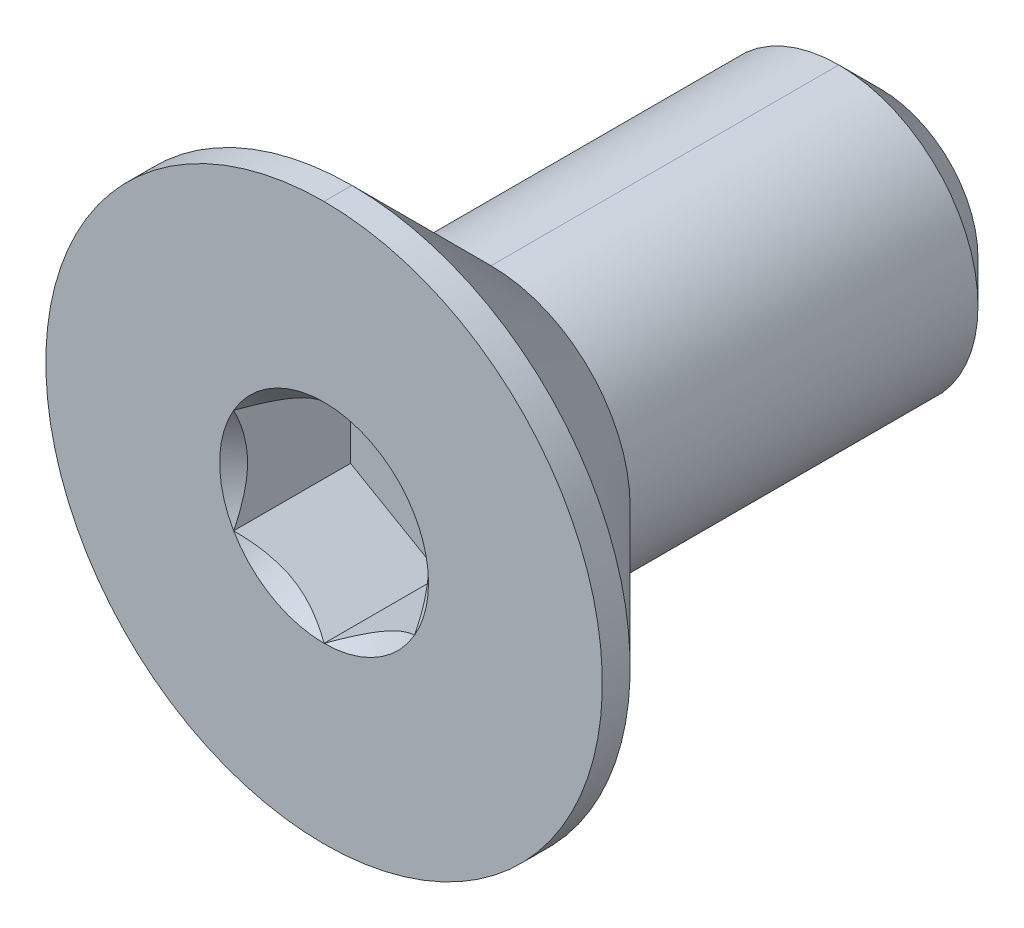
ISO-10303-21;
HEADER;
FILE_DESCRIPTION(('STEP AP214'),'2;1');
FILE_NAME('part.step','',(''),(''),'','','');
FILE_SCHEMA(('AUTOMOTIVE_DESIGN { 1 0 10303 214 1 1 1 1 }'));
ENDSEC;
DATA;
#1=APPLICATION_CONTEXT('core data for automotive mechanical design processes');
#2=APPLICATION_PROTOCOL_DEFINITION('international standard','automotive_design',2000,#1);
#3=PRODUCT_CONTEXT('',#1,'mechanical');
#4=PRODUCT('Part','Part','',(#3));
#5=PRODUCT_RELATED_PRODUCT_CATEGORY('part','',(#4));
#6=PRODUCT_DEFINITION_FORMATION('','',#4);
#7=PRODUCT_DEFINITION_CONTEXT('part definition',#1,'design');
#8=PRODUCT_DEFINITION('design','',#6,#7);
#9=PRODUCT_DEFINITION_SHAPE('','',#8);
#10=(LENGTH_UNIT() NAMED_UNIT(*) SI_UNIT(.MILLI.,.METRE.));
#11=(NAMED_UNIT(*) PLANE_ANGLE_UNIT() SI_UNIT($,.RADIAN.));
#12=(NAMED_UNIT(*) SI_UNIT($,.STERADIAN.) SOLID_ANGLE_UNIT());
#13=UNCERTAINTY_MEASURE_WITH_UNIT(LENGTH_MEASURE(1.E-05),#10,'distance_accuracy_value','');
#14=(GEOMETRIC_REPRESENTATION_CONTEXT(3) GLOBAL_UNCERTAINTY_ASSIGNED_CONTEXT((#13)) GLOBAL_UNIT_ASSIGNED_CONTEXT((#10,
#11,#12)) REPRESENTATION_CONTEXT('',''));
#15=CARTESIAN_POINT('',(0.,0.,0.));
#16=DIRECTION('',(0.,0.,1.));
#17=DIRECTION('',(1.,0.,0.));
#18=AXIS2_PLACEMENT_3D('',#15,#16,#17);
#19=CARTESIAN_POINT('',(0.,0.,0.));
#20=DIRECTION('',(0.,0.,1.));
#21=DIRECTION('',(1.,0.,0.));
#22=AXIS2_PLACEMENT_3D('',#19,#20,#21);
#23=CONICAL_SURFACE('',#22,0.750555349946514,0.78539816339745);
#24=CARTESIAN_POINT('',(0.65,0.,-0.100555349946514));
#25=CARTESIAN_POINT('',(0.65,0.17416697508023,-0.100555349946514));
#26=CARTESIAN_POINT('',(0.65,0.375277674973259,0.));
#27=B_SPLINE_CURVE_WITH_KNOTS('',2,(#24,#25,#26),.UNSPECIFIED.,.F.,.F.,(3,3),(0.,1.),.UNSPECIFIED.);
#28=CARTESIAN_POINT('',(0.65,0.,-0.100555349946514));
#29=VERTEX_POINT('',#28);
#30=CARTESIAN_POINT('',(0.65,0.375277674973259,0.));
#31=VERTEX_POINT('',#30);
#32=EDGE_CURVE('E43',#29,#31,#27,.T.);
#33=ORIENTED_EDGE('',*,*,#32,.F.);
#34=DIRECTION('',(0.707106781186549,0.,0.707106781186546));
#35=VECTOR('',#34,1.);
#36=CARTESIAN_POINT('',(0.750555349946514,0.,0.));
#37=LINE('',#36,#35);
#38=CARTESIAN_POINT('',(0.750555349946514,0.,0.));
#39=VERTEX_POINT('',#38);
#40=EDGE_CURVE('E11',#29,#39,#37,.T.);
#41=ORIENTED_EDGE('',*,*,#40,.T.);
#42=CARTESIAN_POINT('',(0.,0.,0.));
#43=DIRECTION('',(0.,0.,1.));
#44=DIRECTION('',(1.,0.,0.));
#45=AXIS2_PLACEMENT_3D('',#42,#43,#44);
#46=CIRCLE('',#45,0.750555349946514);
#47=EDGE_CURVE('E29',#39,#31,#46,.T.);
#48=ORIENTED_EDGE('',*,*,#47,.T.);
#49=EDGE_LOOP('',(#33,#41,#48));
#50=FACE_BOUND('',#49,.T.);
#51=ADVANCED_FACE('F16',(#50),#23,.F.);
#52=CARTESIAN_POINT('',(0.,0.,-1.2));
#53=DIRECTION('',(0.,0.,1.));
#54=DIRECTION('',(0.,-1.,0.));
#55=AXIS2_PLACEMENT_3D('',#52,#53,#54);
#56=CONICAL_SURFACE('',#55,1.,0.785398163397445);
#57=CARTESIAN_POINT('',(0.,0.,-1.2));
#58=DIRECTION('',(0.,0.,1.));
#59=DIRECTION('',(0.,-1.,0.));
#60=AXIS2_PLACEMENT_3D('',#57,#58,#59);
#61=CIRCLE('',#60,1.);
#62=CARTESIAN_POINT('',(0.,-1.00000000000001,-1.2));
#63=VERTEX_POINT('',#62);
#64=CARTESIAN_POINT('',(0.,1.,-1.2));
#65=VERTEX_POINT('',#64);
#66=EDGE_CURVE('E252',#63,#65,#61,.T.);
#67=ORIENTED_EDGE('',*,*,#66,.T.);
#68=DIRECTION('',(0.,0.707106781186549,0.707106781186546));
#69=VECTOR('',#68,1.);
#70=CARTESIAN_POINT('',(0.,1.,-1.2));
#71=LINE('',#70,#69);
#72=CARTESIAN_POINT('',(0.,2.,-0.200000000000005));
#73=VERTEX_POINT('',#72);
#74=EDGE_CURVE('E461',#65,#73,#71,.T.);
#75=ORIENTED_EDGE('',*,*,#74,.T.);
#76=CARTESIAN_POINT('',(0.,0.,-0.199999999999994));
#77=DIRECTION('',(0.,0.,1.));
#78=DIRECTION('',(0.,-1.,0.));
#79=AXIS2_PLACEMENT_3D('',#76,#77,#78);
#80=CIRCLE('',#79,2.);
#81=CARTESIAN_POINT('',(0.,-2.,-0.199999999999984));
#82=VERTEX_POINT('',#81);
#83=EDGE_CURVE('E457',#82,#73,#80,.T.);
#84=ORIENTED_EDGE('',*,*,#83,.F.);
#85=DIRECTION('',(0.,-0.707106781186542,0.707106781186553));
#86=VECTOR('',#85,1.);
#87=CARTESIAN_POINT('',(0.,-1.00000000000001,-1.2));
#88=LINE('',#87,#86);
#89=EDGE_CURVE('E474',#63,#82,#88,.T.);
#90=ORIENTED_EDGE('',*,*,#89,.F.);
#91=EDGE_LOOP('',(#67,#75,#84,#90));
#92=FACE_BOUND('',#91,.T.);
#93=ADVANCED_FACE('F232',(#92),#56,.T.);
#94=CARTESIAN_POINT('',(0.,0.,0.));
#95=DIRECTION('',(0.,0.,1.));
#96=DIRECTION('',(0.,-1.,0.));
#97=AXIS2_PLACEMENT_3D('',#94,#95,#96);
#98=CYLINDRICAL_SURFACE('',#97,2.);
#99=ORIENTED_EDGE('',*,*,#83,.T.);
#100=DIRECTION('',(0.,0.,1.));
#101=VECTOR('',#100,1.);
#102=CARTESIAN_POINT('',(0.,2.,0.));
#103=LINE('',#102,#101);
#104=CARTESIAN_POINT('',(0.,2.,0.));
#105=VERTEX_POINT('',#104);
#106=EDGE_CURVE('E462',#73,#105,#103,.T.);
#107=ORIENTED_EDGE('',*,*,#106,.T.);
#108=CARTESIAN_POINT('',(0.,0.,0.));
#109=DIRECTION('',(0.,0.,1.));
#110=DIRECTION('',(0.,-1.,0.));
#111=AXIS2_PLACEMENT_3D('',#108,#109,#110);
#112=CIRCLE('',#111,2.);
#113=CARTESIAN_POINT('',(0.,-2.,0.));
#114=VERTEX_POINT('',#113);
#115=EDGE_CURVE('E424',#114,#105,#112,.T.);
#116=ORIENTED_EDGE('',*,*,#115,.F.);
#117=DIRECTION('',(0.,0.,1.));
#118=VECTOR('',#117,1.);
#119=CARTESIAN_POINT('',(0.,-2.,0.));
#120=LINE('',#119,#118);
#121=EDGE_CURVE('E448',#82,#114,#120,.T.);
#122=ORIENTED_EDGE('',*,*,#121,.F.);
#123=EDGE_LOOP('',(#99,#107,#116,#122));
#124=FACE_BOUND('',#123,.T.);
#125=ADVANCED_FACE('F179',(#124),#98,.T.);
#126=CARTESIAN_POINT('',(0.,0.,-4.));
#127=DIRECTION('',(0.,0.,1.));
#128=DIRECTION('',(0.,-1.,0.));
#129=AXIS2_PLACEMENT_3D('',#126,#127,#128);
#130=CONICAL_SURFACE('',#129,0.7,0.785398163397446);
#131=CARTESIAN_POINT('',(0.,0.,-4.));
#132=DIRECTION('',(0.,0.,-1.));
#133=DIRECTION('',(0.,1.,0.));
#134=AXIS2_PLACEMENT_3D('',#131,#132,#133);
#135=CIRCLE('',#134,0.7);
#136=CARTESIAN_POINT('',(0.,0.7,-4.));
#137=VERTEX_POINT('',#136);
#138=CARTESIAN_POINT('',(0.,-0.7,-4.));
#139=VERTEX_POINT('',#138);
#140=EDGE_CURVE('E431',#137,#139,#135,.T.);
#141=ORIENTED_EDGE('',*,*,#140,.F.);
#142=DIRECTION('',(0.,0.707106781186546,0.707106781186549));
#143=VECTOR('',#142,1.);
#144=CARTESIAN_POINT('',(0.,0.7,-4.));
#145=LINE('',#144,#143);
#146=CARTESIAN_POINT('',(0.,1.,-3.7));
#147=VERTEX_POINT('',#146);
#148=EDGE_CURVE('E442',#137,#147,#145,.T.);
#149=ORIENTED_EDGE('',*,*,#148,.T.);
#150=CARTESIAN_POINT('',(0.,0.,-3.7));
#151=DIRECTION('',(0.,0.,1.));
#152=DIRECTION('',(0.,1.,0.));
#153=AXIS2_PLACEMENT_3D('',#150,#151,#152);
#154=CIRCLE('',#153,1.);
#155=CARTESIAN_POINT('',(0.,-1.,-3.7));
#156=VERTEX_POINT('',#155);
#157=EDGE_CURVE('E429',#156,#147,#154,.T.);
#158=ORIENTED_EDGE('',*,*,#157,.F.);
#159=DIRECTION('',(0.,-0.707106781186546,0.707106781186549));
#160=VECTOR('',#159,1.);
#161=CARTESIAN_POINT('',(0.,-0.7,-4.));
#162=LINE('',#161,#160);
#163=EDGE_CURVE('E435',#139,#156,#162,.T.);
#164=ORIENTED_EDGE('',*,*,#163,.F.);
#165=EDGE_LOOP('',(#141,#149,#158,#164));
#166=FACE_BOUND('',#165,.T.);
#167=ADVANCED_FACE('F176',(#166),#130,.T.);
#168=CARTESIAN_POINT('',(0.,0.,-4.));
#169=DIRECTION('',(0.,0.,-1.));
#170=DIRECTION('',(0.,1.,0.));
#171=AXIS2_PLACEMENT_3D('',#168,#169,#170);
#172=CYLINDRICAL_SURFACE('',#171,1.);
#173=ORIENTED_EDGE('',*,*,#66,.F.);
#174=DIRECTION('',(0.,0.,-1.));
#175=VECTOR('',#174,1.);
#176=CARTESIAN_POINT('',(0.,-1.,-4.));
#177=LINE('',#176,#175);
#178=EDGE_CURVE('E439',#63,#156,#177,.T.);
#179=ORIENTED_EDGE('',*,*,#178,.T.);
#180=ORIENTED_EDGE('',*,*,#157,.T.);
#181=DIRECTION('',(0.,0.,-1.));
#182=VECTOR('',#181,1.);
#183=CARTESIAN_POINT('',(0.,1.,-4.));
#184=LINE('',#183,#182);
#185=EDGE_CURVE('E425',#65,#147,#184,.T.);
#186=ORIENTED_EDGE('',*,*,#185,.F.);
#187=EDGE_LOOP('',(#173,#179,#180,#186));
#188=FACE_BOUND('',#187,.T.);
#189=ADVANCED_FACE('F18',(#188),#172,.T.);
#190=CARTESIAN_POINT('',(0.,0.,-4.));
#191=DIRECTION('',(0.,0.,-1.));
#192=DIRECTION('',(0.,1.,0.));
#193=AXIS2_PLACEMENT_3D('',#190,#191,#192);
#194=CYLINDRICAL_SURFACE('',#193,1.);
#195=ORIENTED_EDGE('',*,*,#178,.F.);
#196=CARTESIAN_POINT('',(0.,0.,-1.2));
#197=DIRECTION('',(0.,0.,1.));
#198=DIRECTION('',(0.,-1.,0.));
#199=AXIS2_PLACEMENT_3D('',#196,#197,#198);
#200=CIRCLE('',#199,1.);
#201=EDGE_CURVE('E456',#65,#63,#200,.T.);
#202=ORIENTED_EDGE('',*,*,#201,.F.);
#203=ORIENTED_EDGE('',*,*,#185,.T.);
#204=CARTESIAN_POINT('',(0.,0.,-3.7));
#205=DIRECTION('',(0.,0.,1.));
#206=DIRECTION('',(0.,1.,0.));
#207=AXIS2_PLACEMENT_3D('',#204,#205,#206);
#208=CIRCLE('',#207,1.);
#209=EDGE_CURVE('E430',#147,#156,#208,.T.);
#210=ORIENTED_EDGE('',*,*,#209,.T.);
#211=EDGE_LOOP('',(#195,#202,#203,#210));
#212=FACE_BOUND('',#211,.T.);
#213=ADVANCED_FACE('F233',(#212),#194,.T.);
#214=CARTESIAN_POINT('',(0.,-1.,-4.));
#215=DIRECTION('',(0.,0.,-1.));
#216=DIRECTION('',(0.,-1.,0.));
#217=AXIS2_PLACEMENT_3D('',#214,#215,#216);
#218=PLANE('',#217);
#219=CARTESIAN_POINT('',(0.,0.,-4.));
#220=DIRECTION('',(0.,0.,-1.));
#221=DIRECTION('',(0.,1.,0.));
#222=AXIS2_PLACEMENT_3D('',#219,#220,#221);
#223=CIRCLE('',#222,0.7);
#224=EDGE_CURVE('E434',#139,#137,#223,.T.);
#225=ORIENTED_EDGE('',*,*,#224,.T.);
#226=ORIENTED_EDGE('',*,*,#140,.T.);
#227=EDGE_LOOP('',(#225,#226));
#228=FACE_BOUND('',#227,.T.);
#229=ADVANCED_FACE('F186',(#228),#218,.T.);
#230=CARTESIAN_POINT('',(0.,0.,-4.));
#231=DIRECTION('',(0.,0.,1.));
#232=DIRECTION('',(0.,-1.,0.));
#233=AXIS2_PLACEMENT_3D('',#230,#231,#232);
#234=CONICAL_SURFACE('',#233,0.7,0.785398163397446);
#235=ORIENTED_EDGE('',*,*,#148,.F.);
#236=ORIENTED_EDGE('',*,*,#224,.F.);
#237=ORIENTED_EDGE('',*,*,#163,.T.);
#238=ORIENTED_EDGE('',*,*,#209,.F.);
#239=EDGE_LOOP('',(#235,#236,#237,#238));
#240=FACE_BOUND('',#239,.T.);
#241=ADVANCED_FACE('F362',(#240),#234,.T.);
#242=CARTESIAN_POINT('',(0.,0.,0.));
#243=DIRECTION('',(0.,0.,1.));
#244=DIRECTION('',(0.,-1.,0.));
#245=AXIS2_PLACEMENT_3D('',#242,#243,#244);
#246=CYLINDRICAL_SURFACE('',#245,2.);
#247=ORIENTED_EDGE('',*,*,#106,.F.);
#248=CARTESIAN_POINT('',(0.,0.,-0.199999999999994));
#249=DIRECTION('',(0.,0.,1.));
#250=DIRECTION('',(0.,-1.,0.));
#251=AXIS2_PLACEMENT_3D('',#248,#249,#250);
#252=CIRCLE('',#251,2.);
#253=EDGE_CURVE('E444',#73,#82,#252,.T.);
#254=ORIENTED_EDGE('',*,*,#253,.T.);
#255=ORIENTED_EDGE('',*,*,#121,.T.);
#256=CARTESIAN_POINT('',(0.,0.,0.));
#257=DIRECTION('',(0.,0.,1.));
#258=DIRECTION('',(0.,-1.,0.));
#259=AXIS2_PLACEMENT_3D('',#256,#257,#258);
#260=CIRCLE('',#259,2.);
#261=EDGE_CURVE('E390',#105,#114,#260,.T.);
#262=ORIENTED_EDGE('',*,*,#261,.F.);
#263=EDGE_LOOP('',(#247,#254,#255,#262));
#264=FACE_BOUND('',#263,.T.);
#265=ADVANCED_FACE('F227',(#264),#246,.T.);
#266=CARTESIAN_POINT('',(0.,0.,-1.2));
#267=DIRECTION('',(0.,0.,1.));
#268=DIRECTION('',(0.,-1.,0.));
#269=AXIS2_PLACEMENT_3D('',#266,#267,#268);
#270=CONICAL_SURFACE('',#269,1.,0.785398163397445);
#271=ORIENTED_EDGE('',*,*,#74,.F.);
#272=ORIENTED_EDGE('',*,*,#201,.T.);
#273=ORIENTED_EDGE('',*,*,#89,.T.);
#274=ORIENTED_EDGE('',*,*,#253,.F.);
#275=EDGE_LOOP('',(#271,#272,#273,#274));
#276=FACE_BOUND('',#275,.T.);
#277=ADVANCED_FACE('F223',(#276),#270,.T.);
#278=CARTESIAN_POINT('',(0.,-1.,0.));
#279=DIRECTION('',(0.,0.,1.));
#280=DIRECTION('',(1.,0.,0.));
#281=AXIS2_PLACEMENT_3D('',#278,#279,#280);
#282=PLANE('',#281);
#283=ORIENTED_EDGE('',*,*,#115,.T.);
#284=ORIENTED_EDGE('',*,*,#261,.T.);
#285=EDGE_LOOP('',(#283,#284));
#286=FACE_BOUND('',#285,.T.);
#287=CARTESIAN_POINT('',(0.,0.,0.));
#288=DIRECTION('',(0.,0.,1.));
#289=DIRECTION('',(1.,0.,0.));
#290=AXIS2_PLACEMENT_3D('',#287,#288,#289);
#291=CIRCLE('',#290,0.750555349946514);
#292=CARTESIAN_POINT('',(0.,-0.750555349946514,0.));
#293=VERTEX_POINT('',#292);
#294=CARTESIAN_POINT('',(0.65,-0.375277674973259,0.));
#295=VERTEX_POINT('',#294);
#296=EDGE_CURVE('E132',#293,#295,#291,.T.);
#297=ORIENTED_EDGE('',*,*,#296,.F.);
#298=CARTESIAN_POINT('',(0.,0.,0.));
#299=DIRECTION('',(0.,0.,1.));
#300=DIRECTION('',(1.,0.,0.));
#301=AXIS2_PLACEMENT_3D('',#298,#299,#300);
#302=CIRCLE('',#301,0.750555349946514);
#303=CARTESIAN_POINT('',(-0.65,-0.375277674973256,0.));
#304=VERTEX_POINT('',#303);
#305=EDGE_CURVE('E346',#304,#293,#302,.T.);
#306=ORIENTED_EDGE('',*,*,#305,.F.);
#307=CARTESIAN_POINT('',(0.,0.,0.));
#308=DIRECTION('',(0.,0.,1.));
#309=DIRECTION('',(1.,0.,0.));
#310=AXIS2_PLACEMENT_3D('',#307,#308,#309);
#311=CIRCLE('',#310,0.750555349946514);
#312=CARTESIAN_POINT('',(-0.65,0.375277674973257,0.));
#313=VERTEX_POINT('',#312);
#314=EDGE_CURVE('E308',#313,#304,#311,.T.);
#315=ORIENTED_EDGE('',*,*,#314,.F.);
#316=CARTESIAN_POINT('',(0.,0.,0.));
#317=DIRECTION('',(0.,0.,1.));
#318=DIRECTION('',(1.,0.,0.));
#319=AXIS2_PLACEMENT_3D('',#316,#317,#318);
#320=CIRCLE('',#319,0.750555349946514);
#321=CARTESIAN_POINT('',(0.,0.750555349946514,0.));
#322=VERTEX_POINT('',#321);
#323=EDGE_CURVE('E208',#322,#313,#320,.T.);
#324=ORIENTED_EDGE('',*,*,#323,.F.);
#325=CARTESIAN_POINT('',(0.,0.,0.));
#326=DIRECTION('',(0.,0.,1.));
#327=DIRECTION('',(1.,0.,0.));
#328=AXIS2_PLACEMENT_3D('',#325,#326,#327);
#329=CIRCLE('',#328,0.750555349946514);
#330=EDGE_CURVE('E239',#31,#322,#329,.T.);
#331=ORIENTED_EDGE('',*,*,#330,.F.);
#332=ORIENTED_EDGE('',*,*,#47,.F.);
#333=CARTESIAN_POINT('',(0.,0.,0.));
#334=DIRECTION('',(0.,0.,1.));
#335=DIRECTION('',(1.,0.,0.));
#336=AXIS2_PLACEMENT_3D('',#333,#334,#335);
#337=CIRCLE('',#336,0.750555349946514);
#338=EDGE_CURVE('E247',#295,#39,#337,.T.);
#339=ORIENTED_EDGE('',*,*,#338,.F.);
#340=EDGE_LOOP('',(#297,#306,#315,#324,#331,#332,#339));
#341=FACE_BOUND('',#340,.T.);
#342=ADVANCED_FACE('F226',(#286,#341),#282,.T.);
#343=CARTESIAN_POINT('',(0.,0.,0.));
#344=DIRECTION('',(0.,0.,1.));
#345=DIRECTION('',(1.,0.,0.));
#346=AXIS2_PLACEMENT_3D('',#343,#344,#345);
#347=CONICAL_SURFACE('',#346,0.750555349946514,0.78539816339745);
#348=ORIENTED_EDGE('',*,*,#40,.F.);
#349=CARTESIAN_POINT('',(0.65,-0.375277674973259,0.));
#350=CARTESIAN_POINT('',(0.65,-0.174166975080231,-0.100555349946514));
#351=CARTESIAN_POINT('',(0.65,0.,-0.100555349946514));
#352=B_SPLINE_CURVE_WITH_KNOTS('',2,(#349,#350,#351),.UNSPECIFIED.,.F.,.F.,(3,3),(0.,1.),.UNSPECIFIED.);
#353=EDGE_CURVE('E266',#295,#29,#352,.T.);
#354=ORIENTED_EDGE('',*,*,#353,.F.);
#355=ORIENTED_EDGE('',*,*,#338,.T.);
#356=EDGE_LOOP('',(#348,#354,#355));
#357=FACE_BOUND('',#356,.T.);
#358=ADVANCED_FACE('F221',(#357),#347,.F.);
#359=CARTESIAN_POINT('',(0.,0.,0.));
#360=DIRECTION('',(0.,0.,1.));
#361=DIRECTION('',(1.,0.,0.));
#362=AXIS2_PLACEMENT_3D('',#359,#360,#361);
#363=CONICAL_SURFACE('',#362,0.750555349946514,0.78539816339745);
#364=ORIENTED_EDGE('',*,*,#330,.T.);
#365=CARTESIAN_POINT('',(0.649999999999999,0.375277674973258,0.));
#366=CARTESIAN_POINT('',(0.477573641460305,0.474828079491537,-0.0995504045182821));
#367=CARTESIAN_POINT('',(0.326198492103037,0.562224562721576,-0.100553876734538));
#368=CARTESIAN_POINT('',(0.175890238338834,0.649005073493761,-0.101550276455145));
#369=CARTESIAN_POINT('',(0.,0.750555349946514,0.));
#370=B_SPLINE_CURVE_WITH_KNOTS('',2,(#365,#366,#367,#368,#369),.UNSPECIFIED.,.F.,.F.,(3,2,3),
(0.,0.5,1.),.UNSPECIFIED.);
#371=EDGE_CURVE('E203',#31,#322,#370,.T.);
#372=ORIENTED_EDGE('',*,*,#371,.F.);
#373=EDGE_LOOP('',(#364,#372));
#374=FACE_BOUND('',#373,.T.);
#375=ADVANCED_FACE('F210',(#374),#363,.F.);
#376=CARTESIAN_POINT('',(0.,0.,0.));
#377=DIRECTION('',(0.,0.,1.));
#378=DIRECTION('',(1.,0.,0.));
#379=AXIS2_PLACEMENT_3D('',#376,#377,#378);
#380=CONICAL_SURFACE('',#379,0.750555349946514,0.78539816339745);
#381=ORIENTED_EDGE('',*,*,#323,.T.);
#382=CARTESIAN_POINT('',(0.,0.750555349946514,0.));
#383=CARTESIAN_POINT('',(-0.172426358539693,0.651004945428236,-0.099550404518278));
#384=CARTESIAN_POINT('',(-0.323801507896963,0.563608462198196,-0.100553876734538));
#385=CARTESIAN_POINT('',(-0.474109761661159,0.476827951426015,-0.101550276455149));
#386=CARTESIAN_POINT('',(-0.650000000000001,0.375277674973257,0.));
#387=B_SPLINE_CURVE_WITH_KNOTS('',2,(#382,#383,#384,#385,#386),.UNSPECIFIED.,.F.,.F.,(3,2,3),
(0.,0.5,1.),.UNSPECIFIED.);
#388=EDGE_CURVE('E276',#322,#313,#387,.T.);
#389=ORIENTED_EDGE('',*,*,#388,.F.);
#390=EDGE_LOOP('',(#381,#389));
#391=FACE_BOUND('',#390,.T.);
#392=ADVANCED_FACE('F220',(#391),#380,.F.);
#393=CARTESIAN_POINT('',(0.,0.,0.));
#394=DIRECTION('',(0.,0.,1.));
#395=DIRECTION('',(1.,0.,0.));
#396=AXIS2_PLACEMENT_3D('',#393,#394,#395);
#397=CONICAL_SURFACE('',#396,0.750555349946514,0.78539816339745);
#398=ORIENTED_EDGE('',*,*,#314,.T.);
#399=CARTESIAN_POINT('',(-0.65,0.375277674973257,0.));
#400=CARTESIAN_POINT('',(-0.65,0.175472140125833,-0.0999027674237119));
#401=CARTESIAN_POINT('',(-0.65,4.09158929415461E-05,-0.100555348658736));
#402=CARTESIAN_POINT('',(-0.65,-0.172880487596281,-0.101198593688488));
#403=CARTESIAN_POINT('',(-0.65,-0.375277674973256,0.));
#404=B_SPLINE_CURVE_WITH_KNOTS('',2,(#399,#400,#401,#402,#403),.UNSPECIFIED.,.F.,.F.,(3,2,3),
(0.,0.5,1.),.UNSPECIFIED.);
#405=EDGE_CURVE('E341',#313,#304,#404,.T.);
#406=ORIENTED_EDGE('',*,*,#405,.F.);
#407=EDGE_LOOP('',(#398,#406));
#408=FACE_BOUND('',#407,.T.);
#409=ADVANCED_FACE('F319',(#408),#397,.F.);
#410=CARTESIAN_POINT('',(0.,0.,0.));
#411=DIRECTION('',(0.,0.,1.));
#412=DIRECTION('',(1.,0.,0.));
#413=AXIS2_PLACEMENT_3D('',#410,#411,#412);
#414=CONICAL_SURFACE('',#413,0.750555349946514,0.78539816339745);
#415=ORIENTED_EDGE('',*,*,#305,.T.);
#416=CARTESIAN_POINT('',(-0.65,-0.375277674973256,0.));
#417=CARTESIAN_POINT('',(-0.47757364146031,-0.474828079491533,-0.0995504045182787));
#418=CARTESIAN_POINT('',(-0.326198492103036,-0.562224562721575,-0.100553876734539));
#419=CARTESIAN_POINT('',(-0.175890238338839,-0.649005073493756,-0.10155027645515));
#420=CARTESIAN_POINT('',(0.,-0.750555349946514,0.));
#421=B_SPLINE_CURVE_WITH_KNOTS('',2,(#416,#417,#418,#419,#420),.UNSPECIFIED.,.F.,.F.,(3,2,3),
(0.,0.5,1.),.UNSPECIFIED.);
#422=EDGE_CURVE('E138',#304,#293,#421,.T.);
#423=ORIENTED_EDGE('',*,*,#422,.F.);
#424=EDGE_LOOP('',(#415,#423));
#425=FACE_BOUND('',#424,.T.);
#426=ADVANCED_FACE('F356',(#425),#414,.F.);
#427=CARTESIAN_POINT('',(0.,0.,0.));
#428=DIRECTION('',(0.,0.,1.));
#429=DIRECTION('',(1.,0.,0.));
#430=AXIS2_PLACEMENT_3D('',#427,#428,#429);
#431=CONICAL_SURFACE('',#430,0.750555349946514,0.78539816339745);
#432=ORIENTED_EDGE('',*,*,#296,.T.);
#433=CARTESIAN_POINT('',(0.,-0.750555349946513,0.));
#434=CARTESIAN_POINT('',(0.172426358539686,-0.651004945428239,-0.099550404518279));
#435=CARTESIAN_POINT('',(0.323801507896962,-0.563608462198195,-0.100553876734539));
#436=CARTESIAN_POINT('',(0.474109761661161,-0.476827951426013,-0.10155027645515));
#437=CARTESIAN_POINT('',(0.649999999999999,-0.375277674973257,0.));
#438=B_SPLINE_CURVE_WITH_KNOTS('',2,(#433,#434,#435,#436,#437),.UNSPECIFIED.,.F.,.F.,(3,2,3),
(0.,0.5,1.),.UNSPECIFIED.);
#439=EDGE_CURVE('E142',#293,#295,#438,.T.);
#440=ORIENTED_EDGE('',*,*,#439,.F.);
#441=EDGE_LOOP('',(#432,#440));
#442=FACE_BOUND('',#441,.T.);
#443=ADVANCED_FACE('F360',(#442),#431,.F.);
#444=CARTESIAN_POINT('',(0.65,-0.375277674973257,-0.84));
#445=DIRECTION('',(0.,0.,1.));
#446=DIRECTION('',(1.,0.,0.));
#447=AXIS2_PLACEMENT_3D('',#444,#445,#446);
#448=PLANE('',#447);
#449=DIRECTION('',(0.866025403784439,0.5,0.));
#450=VECTOR('',#449,1.);
#451=CARTESIAN_POINT('',(0.,-0.750555349946513,-0.84));
#452=LINE('',#451,#450);
#453=CARTESIAN_POINT('',(0.,-0.750555349946513,-0.84));
#454=VERTEX_POINT('',#453);
#455=CARTESIAN_POINT('',(0.65,-0.375277674973257,-0.84));
#456=VERTEX_POINT('',#455);
#457=EDGE_CURVE('E116',#454,#456,#452,.T.);
#458=ORIENTED_EDGE('',*,*,#457,.T.);
#459=DIRECTION('',(0.,1.,0.));
#460=VECTOR('',#459,1.);
#461=CARTESIAN_POINT('',(0.65,-0.375277674973257,-0.84));
#462=LINE('',#461,#460);
#463=CARTESIAN_POINT('',(0.65,0.375277674973257,-0.84));
#464=VERTEX_POINT('',#463);
#465=EDGE_CURVE('E133',#456,#464,#462,.T.);
#466=ORIENTED_EDGE('',*,*,#465,.T.);
#467=DIRECTION('',(-0.866025403784439,0.5,0.));
#468=VECTOR('',#467,1.);
#469=CARTESIAN_POINT('',(0.65,0.375277674973257,-0.84));
#470=LINE('',#469,#468);
#471=CARTESIAN_POINT('',(0.,0.750555349946514,-0.84));
#472=VERTEX_POINT('',#471);
#473=EDGE_CURVE('E438',#464,#472,#470,.T.);
#474=ORIENTED_EDGE('',*,*,#473,.T.);
#475=DIRECTION('',(-0.866025403784439,-0.5,0.));
#476=VECTOR('',#475,1.);
#477=CARTESIAN_POINT('',(0.,0.750555349946514,-0.84));
#478=LINE('',#477,#476);
#479=CARTESIAN_POINT('',(-0.65,0.375277674973257,-0.84));
#480=VERTEX_POINT('',#479);
#481=EDGE_CURVE('E452',#472,#480,#478,.T.);
#482=ORIENTED_EDGE('',*,*,#481,.T.);
#483=DIRECTION('',(0.,-1.,0.));
#484=VECTOR('',#483,1.);
#485=CARTESIAN_POINT('',(-0.65,0.375277674973257,-0.84));
#486=LINE('',#485,#484);
#487=CARTESIAN_POINT('',(-0.65,-0.375277674973256,-0.84));
#488=VERTEX_POINT('',#487);
#489=EDGE_CURVE('E119',#480,#488,#486,.T.);
#490=ORIENTED_EDGE('',*,*,#489,.T.);
#491=DIRECTION('',(0.866025403784439,-0.5,0.));
#492=VECTOR('',#491,1.);
#493=CARTESIAN_POINT('',(-0.65,-0.375277674973256,-0.84));
#494=LINE('',#493,#492);
#495=EDGE_CURVE('E106',#488,#454,#494,.T.);
#496=ORIENTED_EDGE('',*,*,#495,.T.);
#497=EDGE_LOOP('',(#458,#466,#474,#482,#490,#496));
#498=FACE_BOUND('',#497,.T.);
#499=ADVANCED_FACE('F114',(#498),#448,.T.);
#500=CARTESIAN_POINT('',(0.65,-0.375277674973257,-0.84));
#501=DIRECTION('',(1.,0.,0.));
#502=DIRECTION('',(0.,0.,1.));
#503=AXIS2_PLACEMENT_3D('',#500,#501,#502);
#504=PLANE('',#503);
#505=DIRECTION('',(0.,0.,1.));
#506=VECTOR('',#505,1.);
#507=CARTESIAN_POINT('',(0.65,-0.375277674973257,-0.84));
#508=LINE('',#507,#506);
#509=EDGE_CURVE('E122',#456,#295,#508,.T.);
#510=ORIENTED_EDGE('',*,*,#509,.T.);
#511=ORIENTED_EDGE('',*,*,#353,.T.);
#512=ORIENTED_EDGE('',*,*,#32,.T.);
#513=DIRECTION('',(0.,0.,1.));
#514=VECTOR('',#513,1.);
#515=CARTESIAN_POINT('',(0.65,0.375277674973257,-0.84));
#516=LINE('',#515,#514);
#517=EDGE_CURVE('E255',#464,#31,#516,.T.);
#518=ORIENTED_EDGE('',*,*,#517,.F.);
#519=ORIENTED_EDGE('',*,*,#465,.F.);
#520=EDGE_LOOP('',(#510,#511,#512,#518,#519));
#521=FACE_BOUND('',#520,.T.);
#522=ADVANCED_FACE('F184',(#521),#504,.F.);
#523=CARTESIAN_POINT('',(0.65,0.375277674973257,-0.84));
#524=DIRECTION('',(0.5,0.866025403784439,0.));
#525=DIRECTION('',(0.,0.,-1.));
#526=AXIS2_PLACEMENT_3D('',#523,#524,#525);
#527=PLANE('',#526);
#528=ORIENTED_EDGE('',*,*,#517,.T.);
#529=ORIENTED_EDGE('',*,*,#371,.T.);
#530=DIRECTION('',(0.,0.,1.));
#531=VECTOR('',#530,1.);
#532=CARTESIAN_POINT('',(0.,0.750555349946514,-0.84));
#533=LINE('',#532,#531);
#534=EDGE_CURVE('E268',#472,#322,#533,.T.);
#535=ORIENTED_EDGE('',*,*,#534,.F.);
#536=ORIENTED_EDGE('',*,*,#473,.F.);
#537=EDGE_LOOP('',(#528,#529,#535,#536));
#538=FACE_BOUND('',#537,.T.);
#539=ADVANCED_FACE('F181',(#538),#527,.F.);
#540=CARTESIAN_POINT('',(0.,0.750555349946514,-0.84));
#541=DIRECTION('',(-0.5,0.866025403784439,0.));
#542=DIRECTION('',(0.,0.,1.));
#543=AXIS2_PLACEMENT_3D('',#540,#541,#542);
#544=PLANE('',#543);
#545=ORIENTED_EDGE('',*,*,#534,.T.);
#546=ORIENTED_EDGE('',*,*,#388,.T.);
#547=DIRECTION('',(0.,0.,1.));
#548=VECTOR('',#547,1.);
#549=CARTESIAN_POINT('',(-0.65,0.375277674973257,-0.84));
#550=LINE('',#549,#548);
#551=EDGE_CURVE('E284',#480,#313,#550,.T.);
#552=ORIENTED_EDGE('',*,*,#551,.F.);
#553=ORIENTED_EDGE('',*,*,#481,.F.);
#554=EDGE_LOOP('',(#545,#546,#552,#553));
#555=FACE_BOUND('',#554,.T.);
#556=ADVANCED_FACE('F173',(#555),#544,.F.);
#557=CARTESIAN_POINT('',(-0.65,0.375277674973257,-0.84));
#558=DIRECTION('',(-1.,0.,0.));
#559=DIRECTION('',(0.,1.,0.));
#560=AXIS2_PLACEMENT_3D('',#557,#558,#559);
#561=PLANE('',#560);
#562=ORIENTED_EDGE('',*,*,#551,.T.);
#563=ORIENTED_EDGE('',*,*,#405,.T.);
#564=DIRECTION('',(0.,0.,1.));
#565=VECTOR('',#564,1.);
#566=CARTESIAN_POINT('',(-0.65,-0.375277674973256,-0.84));
#567=LINE('',#566,#565);
#568=EDGE_CURVE('E148',#488,#304,#567,.T.);
#569=ORIENTED_EDGE('',*,*,#568,.F.);
#570=ORIENTED_EDGE('',*,*,#489,.F.);
#571=EDGE_LOOP('',(#562,#563,#569,#570));
#572=FACE_BOUND('',#571,.T.);
#573=ADVANCED_FACE('F322',(#572),#561,.F.);
#574=CARTESIAN_POINT('',(-0.65,-0.375277674973256,-0.84));
#575=DIRECTION('',(-0.5,-0.866025403784439,0.));
#576=DIRECTION('',(-0.866025403784439,0.5,0.));
#577=AXIS2_PLACEMENT_3D('',#574,#575,#576);
#578=PLANE('',#577);
#579=ORIENTED_EDGE('',*,*,#568,.T.);
#580=ORIENTED_EDGE('',*,*,#422,.T.);
#581=DIRECTION('',(0.,0.,1.));
#582=VECTOR('',#581,1.);
#583=CARTESIAN_POINT('',(0.,-0.750555349946513,-0.84));
#584=LINE('',#583,#582);
#585=EDGE_CURVE('E129',#454,#293,#584,.T.);
#586=ORIENTED_EDGE('',*,*,#585,.F.);
#587=ORIENTED_EDGE('',*,*,#495,.F.);
#588=EDGE_LOOP('',(#579,#580,#586,#587));
#589=FACE_BOUND('',#588,.T.);
#590=ADVANCED_FACE('F136',(#589),#578,.F.);
#591=CARTESIAN_POINT('',(0.,-0.750555349946513,-0.84));
#592=DIRECTION('',(0.5,-0.866025403784439,0.));
#593=DIRECTION('',(0.,0.,-1.));
#594=AXIS2_PLACEMENT_3D('',#591,#592,#593);
#595=PLANE('',#594);
#596=ORIENTED_EDGE('',*,*,#585,.T.);
#597=ORIENTED_EDGE('',*,*,#439,.T.);
#598=ORIENTED_EDGE('',*,*,#509,.F.);
#599=ORIENTED_EDGE('',*,*,#457,.F.);
#600=EDGE_LOOP('',(#596,#597,#598,#599));
#601=FACE_BOUND('',#600,.T.);
#602=ADVANCED_FACE('F126',(#601),#595,.F.);
#603=CLOSED_SHELL('',(#51,#93,#125,#167,#189,#213,#229,#241,#265,#277,#342,#358,#375,#392,#409,
#426,#443,#499,#522,#539,#556,#573,#590,#602));
#604=MANIFOLD_SOLID_BREP('B1',#603);
#605=ADVANCED_BREP_SHAPE_REPRESENTATION('',(#18,#604),#14);
#606=SHAPE_DEFINITION_REPRESENTATION(#9,#605);
ENDSEC;
END-ISO-10303-21;
